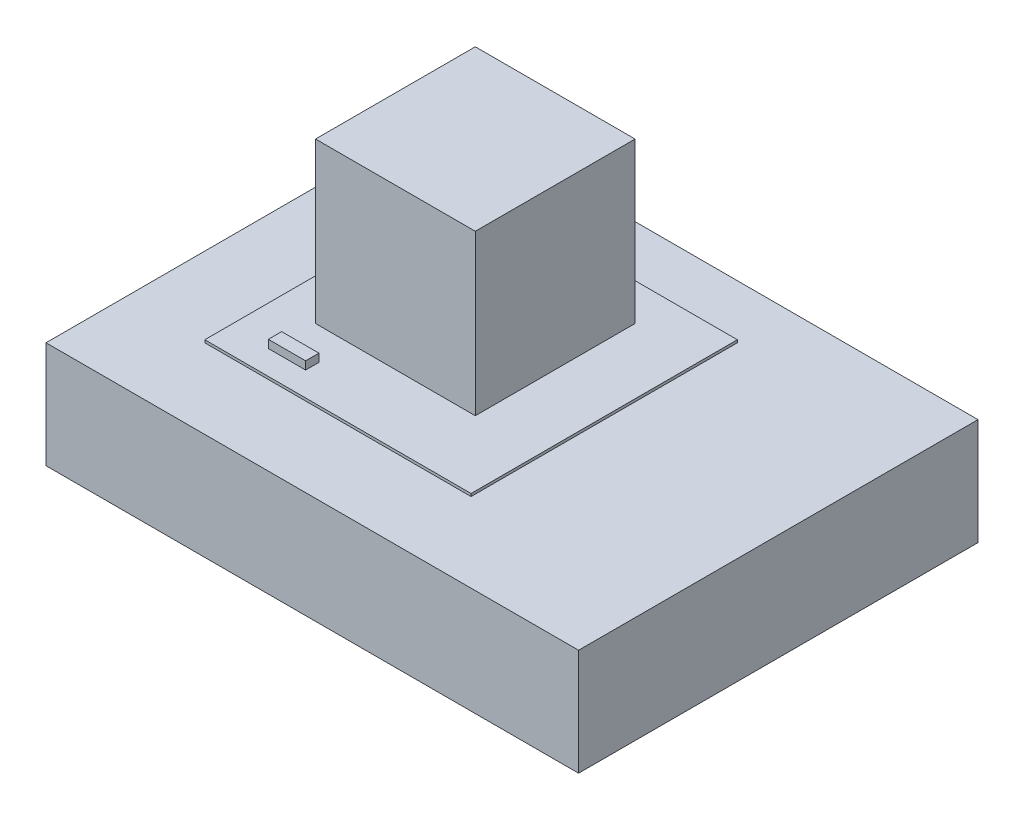
ISO-10303-21;
HEADER;
FILE_DESCRIPTION(('STEP AP214'),'2;1');
FILE_NAME('part.step','',(''),(''),'','','');
FILE_SCHEMA(('AUTOMOTIVE_DESIGN { 1 0 10303 214 1 1 1 1 }'));
ENDSEC;
DATA;
#1=APPLICATION_CONTEXT('core data for automotive mechanical design processes');
#2=APPLICATION_PROTOCOL_DEFINITION('international standard','automotive_design',2000,#1);
#3=PRODUCT_CONTEXT('',#1,'mechanical');
#4=PRODUCT('Part','Part','',(#3));
#5=PRODUCT_RELATED_PRODUCT_CATEGORY('part','',(#4));
#6=PRODUCT_DEFINITION_FORMATION('','',#4);
#7=PRODUCT_DEFINITION_CONTEXT('part definition',#1,'design');
#8=PRODUCT_DEFINITION('design','',#6,#7);
#9=PRODUCT_DEFINITION_SHAPE('','',#8);
#10=(LENGTH_UNIT() NAMED_UNIT(*) SI_UNIT(.MILLI.,.METRE.));
#11=(NAMED_UNIT(*) PLANE_ANGLE_UNIT() SI_UNIT($,.RADIAN.));
#12=(NAMED_UNIT(*) SI_UNIT($,.STERADIAN.) SOLID_ANGLE_UNIT());
#13=UNCERTAINTY_MEASURE_WITH_UNIT(LENGTH_MEASURE(1.E-05),#10,'distance_accuracy_value','');
#14=(GEOMETRIC_REPRESENTATION_CONTEXT(3) GLOBAL_UNCERTAINTY_ASSIGNED_CONTEXT((#13)) GLOBAL_UNIT_ASSIGNED_CONTEXT((#10,
#11,#12)) REPRESENTATION_CONTEXT('',''));
#15=CARTESIAN_POINT('',(0.,0.,0.));
#16=DIRECTION('',(0.,0.,1.));
#17=DIRECTION('',(1.,0.,0.));
#18=AXIS2_PLACEMENT_3D('',#15,#16,#17);
#19=CARTESIAN_POINT('',(0.,41.,0.));
#20=DIRECTION('',(0.,1.,0.));
#21=DIRECTION('',(0.,0.,1.));
#22=AXIS2_PLACEMENT_3D('',#19,#20,#21);
#23=PLANE('',#22);
#24=DIRECTION('',(1.,0.,0.));
#25=VECTOR('',#24,1.);
#26=CARTESIAN_POINT('',(-4.26515979318864,41.,60.));
#27=LINE('',#26,#25);
#28=CARTESIAN_POINT('',(-4.26515979318864,41.,60.));
#29=VERTEX_POINT('',#28);
#30=CARTESIAN_POINT('',(55.7348402068114,41.,60.));
#31=VERTEX_POINT('',#30);
#32=EDGE_CURVE('E179',#29,#31,#27,.T.);
#33=ORIENTED_EDGE('',*,*,#32,.F.);
#34=DIRECTION('',(0.,0.,1.));
#35=VECTOR('',#34,1.);
#36=CARTESIAN_POINT('',(-4.26515979318864,41.,0.));
#37=LINE('',#36,#35);
#38=CARTESIAN_POINT('',(-4.26515979318864,41.,0.));
#39=VERTEX_POINT('',#38);
#40=EDGE_CURVE('E176',#39,#29,#37,.T.);
#41=ORIENTED_EDGE('',*,*,#40,.F.);
#42=DIRECTION('',(-1.,0.,0.));
#43=VECTOR('',#42,1.);
#44=CARTESIAN_POINT('',(-4.26515979318864,41.,0.));
#45=LINE('',#44,#43);
#46=CARTESIAN_POINT('',(55.7348402068113,41.,0.));
#47=VERTEX_POINT('',#46);
#48=EDGE_CURVE('E188',#47,#39,#45,.T.);
#49=ORIENTED_EDGE('',*,*,#48,.F.);
#50=DIRECTION('',(0.,0.,-1.));
#51=VECTOR('',#50,1.);
#52=CARTESIAN_POINT('',(55.7348402068113,41.,0.));
#53=LINE('',#52,#51);
#54=EDGE_CURVE('E196',#31,#47,#53,.T.);
#55=ORIENTED_EDGE('',*,*,#54,.F.);
#56=EDGE_LOOP('',(#33,#41,#49,#55));
#57=FACE_BOUND('',#56,.T.);
#58=DIRECTION('',(0.,0.,1.));
#59=VECTOR('',#58,1.);
#60=CARTESIAN_POINT('',(-19.7768031434268,41.,-13.9236227884572));
#61=LINE('',#60,#59);
#62=CARTESIAN_POINT('',(-19.7768031434268,41.,-13.9236227884572));
#63=VERTEX_POINT('',#62);
#64=CARTESIAN_POINT('',(-19.7768031434268,41.,86.0763772115428));
#65=VERTEX_POINT('',#64);
#66=EDGE_CURVE('E208',#63,#65,#61,.T.);
#67=ORIENTED_EDGE('',*,*,#66,.T.);
#68=DIRECTION('',(1.,0.,0.));
#69=VECTOR('',#68,1.);
#70=CARTESIAN_POINT('',(-19.7768031434268,41.,86.0763772115428));
#71=LINE('',#70,#69);
#72=CARTESIAN_POINT('',(80.2231968565732,41.,86.0763772115428));
#73=VERTEX_POINT('',#72);
#74=EDGE_CURVE('E211',#65,#73,#71,.T.);
#75=ORIENTED_EDGE('',*,*,#74,.T.);
#76=DIRECTION('',(0.,0.,-1.));
#77=VECTOR('',#76,1.);
#78=CARTESIAN_POINT('',(80.2231968565732,41.,-13.9236227884572));
#79=LINE('',#78,#77);
#80=CARTESIAN_POINT('',(80.2231968565732,41.,-13.9236227884572));
#81=VERTEX_POINT('',#80);
#82=EDGE_CURVE('E214',#73,#81,#79,.T.);
#83=ORIENTED_EDGE('',*,*,#82,.T.);
#84=DIRECTION('',(-1.,0.,0.));
#85=VECTOR('',#84,1.);
#86=CARTESIAN_POINT('',(-19.7768031434268,41.,-13.9236227884572));
#87=LINE('',#86,#85);
#88=EDGE_CURVE('E216',#81,#63,#87,.T.);
#89=ORIENTED_EDGE('',*,*,#88,.T.);
#90=EDGE_LOOP('',(#67,#75,#83,#89));
#91=FACE_BOUND('',#90,.T.);
#92=DIRECTION('',(1.,0.,0.));
#93=VECTOR('',#92,1.);
#94=CARTESIAN_POINT('',(-4.98770208661092,41.,77.0000763242865));
#95=LINE('',#94,#93);
#96=CARTESIAN_POINT('',(-4.98770208661092,41.,77.0000763242865));
#97=VERTEX_POINT('',#96);
#98=CARTESIAN_POINT('',(9.01229791338908,41.,77.0000763242865));
#99=VERTEX_POINT('',#98);
#100=EDGE_CURVE('E496',#97,#99,#95,.T.);
#101=ORIENTED_EDGE('',*,*,#100,.F.);
#102=DIRECTION('',(0.,0.,1.));
#103=VECTOR('',#102,1.);
#104=CARTESIAN_POINT('',(-4.98770208661092,41.,72.0000763242865));
#105=LINE('',#104,#103);
#106=CARTESIAN_POINT('',(-4.98770208661092,41.,72.0000763242865));
#107=VERTEX_POINT('',#106);
#108=EDGE_CURVE('E174',#107,#97,#105,.T.);
#109=ORIENTED_EDGE('',*,*,#108,.F.);
#110=DIRECTION('',(-1.,0.,0.));
#111=VECTOR('',#110,1.);
#112=CARTESIAN_POINT('',(-4.98770208661092,41.,72.0000763242865));
#113=LINE('',#112,#111);
#114=CARTESIAN_POINT('',(9.01229791338908,41.,72.0000763242865));
#115=VERTEX_POINT('',#114);
#116=EDGE_CURVE('E170',#115,#107,#113,.T.);
#117=ORIENTED_EDGE('',*,*,#116,.F.);
#118=DIRECTION('',(0.,0.,-1.));
#119=VECTOR('',#118,1.);
#120=CARTESIAN_POINT('',(9.01229791338908,41.,72.0000763242865));
#121=LINE('',#120,#119);
#122=EDGE_CURVE('E493',#99,#115,#121,.T.);
#123=ORIENTED_EDGE('',*,*,#122,.F.);
#124=EDGE_LOOP('',(#101,#109,#117,#123));
#125=FACE_BOUND('',#124,.T.);
#126=ADVANCED_FACE('F37',(#57,#91,#125),#23,.T.);
#127=CARTESIAN_POINT('',(0.,40.,0.));
#128=DIRECTION('',(0.,1.,0.));
#129=DIRECTION('',(0.,0.,1.));
#130=AXIS2_PLACEMENT_3D('',#127,#128,#129);
#131=PLANE('',#130);
#132=DIRECTION('',(0.,0.,1.));
#133=VECTOR('',#132,1.);
#134=CARTESIAN_POINT('',(-49.6101921751245,40.,-34.1278167647669));
#135=LINE('',#134,#133);
#136=CARTESIAN_POINT('',(-49.6101921751245,40.,-34.1278167647669));
#137=VERTEX_POINT('',#136);
#138=CARTESIAN_POINT('',(-49.6101921751245,40.,115.872183235233));
#139=VERTEX_POINT('',#138);
#140=EDGE_CURVE('E237',#137,#139,#135,.T.);
#141=ORIENTED_EDGE('',*,*,#140,.T.);
#142=DIRECTION('',(1.,0.,0.));
#143=VECTOR('',#142,1.);
#144=CARTESIAN_POINT('',(-49.6101921751245,40.,115.872183235233));
#145=LINE('',#144,#143);
#146=CARTESIAN_POINT('',(150.389807824876,40.,115.872183235233));
#147=VERTEX_POINT('',#146);
#148=EDGE_CURVE('E240',#139,#147,#145,.T.);
#149=ORIENTED_EDGE('',*,*,#148,.T.);
#150=DIRECTION('',(0.,0.,-1.));
#151=VECTOR('',#150,1.);
#152=CARTESIAN_POINT('',(150.389807824875,40.,-34.1278167647669));
#153=LINE('',#152,#151);
#154=CARTESIAN_POINT('',(150.389807824875,40.,-34.1278167647669));
#155=VERTEX_POINT('',#154);
#156=EDGE_CURVE('E243',#147,#155,#153,.T.);
#157=ORIENTED_EDGE('',*,*,#156,.T.);
#158=DIRECTION('',(-1.,0.,0.));
#159=VECTOR('',#158,1.);
#160=CARTESIAN_POINT('',(-49.6101921751245,40.,-34.1278167647669));
#161=LINE('',#160,#159);
#162=EDGE_CURVE('E245',#155,#137,#161,.T.);
#163=ORIENTED_EDGE('',*,*,#162,.T.);
#164=EDGE_LOOP('',(#141,#149,#157,#163));
#165=FACE_BOUND('',#164,.T.);
#166=DIRECTION('',(1.,0.,0.));
#167=VECTOR('',#166,1.);
#168=CARTESIAN_POINT('',(-19.7768031434268,40.,86.0763772115428));
#169=LINE('',#168,#167);
#170=CARTESIAN_POINT('',(-19.7768031434268,40.,86.0763772115428));
#171=VERTEX_POINT('',#170);
#172=CARTESIAN_POINT('',(80.2231968565732,40.,86.0763772115428));
#173=VERTEX_POINT('',#172);
#174=EDGE_CURVE('E221',#171,#173,#169,.T.);
#175=ORIENTED_EDGE('',*,*,#174,.F.);
#176=DIRECTION('',(0.,0.,1.));
#177=VECTOR('',#176,1.);
#178=CARTESIAN_POINT('',(-19.7768031434268,40.,-13.9236227884572));
#179=LINE('',#178,#177);
#180=CARTESIAN_POINT('',(-19.7768031434268,40.,-13.9236227884572));
#181=VERTEX_POINT('',#180);
#182=EDGE_CURVE('E207',#181,#171,#179,.T.);
#183=ORIENTED_EDGE('',*,*,#182,.F.);
#184=DIRECTION('',(-1.,0.,0.));
#185=VECTOR('',#184,1.);
#186=CARTESIAN_POINT('',(-19.7768031434268,40.,-13.9236227884572));
#187=LINE('',#186,#185);
#188=CARTESIAN_POINT('',(80.2231968565732,40.,-13.9236227884572));
#189=VERTEX_POINT('',#188);
#190=EDGE_CURVE('E212',#189,#181,#187,.T.);
#191=ORIENTED_EDGE('',*,*,#190,.F.);
#192=DIRECTION('',(0.,0.,-1.));
#193=VECTOR('',#192,1.);
#194=CARTESIAN_POINT('',(80.2231968565732,40.,-13.9236227884572));
#195=LINE('',#194,#193);
#196=EDGE_CURVE('E223',#173,#189,#195,.T.);
#197=ORIENTED_EDGE('',*,*,#196,.F.);
#198=EDGE_LOOP('',(#175,#183,#191,#197));
#199=FACE_BOUND('',#198,.T.);
#200=ADVANCED_FACE('F279',(#165,#199),#131,.T.);
#201=CARTESIAN_POINT('',(-49.6101921751245,40.,-34.1278167647669));
#202=DIRECTION('',(1.,0.,0.));
#203=DIRECTION('',(0.,0.,-1.));
#204=AXIS2_PLACEMENT_3D('',#201,#202,#203);
#205=PLANE('',#204);
#206=DIRECTION('',(0.,0.,1.));
#207=VECTOR('',#206,1.);
#208=CARTESIAN_POINT('',(-49.6101921751245,0.,-34.1278167647669));
#209=LINE('',#208,#207);
#210=CARTESIAN_POINT('',(-49.6101921751245,0.,-34.1278167647669));
#211=VERTEX_POINT('',#210);
#212=CARTESIAN_POINT('',(-49.6101921751245,0.,115.872183235233));
#213=VERTEX_POINT('',#212);
#214=EDGE_CURVE('E236',#211,#213,#209,.T.);
#215=ORIENTED_EDGE('',*,*,#214,.T.);
#216=DIRECTION('',(0.,-1.,0.));
#217=VECTOR('',#216,1.);
#218=CARTESIAN_POINT('',(-49.6101921751245,40.,115.872183235233));
#219=LINE('',#218,#217);
#220=EDGE_CURVE('E11',#139,#213,#219,.T.);
#221=ORIENTED_EDGE('',*,*,#220,.F.);
#222=ORIENTED_EDGE('',*,*,#140,.F.);
#223=DIRECTION('',(0.,-1.,0.));
#224=VECTOR('',#223,1.);
#225=CARTESIAN_POINT('',(-49.6101921751245,40.,-34.1278167647669));
#226=LINE('',#225,#224);
#227=EDGE_CURVE('E247',#137,#211,#226,.T.);
#228=ORIENTED_EDGE('',*,*,#227,.T.);
#229=EDGE_LOOP('',(#215,#221,#222,#228));
#230=FACE_BOUND('',#229,.T.);
#231=ADVANCED_FACE('F39',(#230),#205,.F.);
#232=CARTESIAN_POINT('',(-49.6101921751245,40.,115.872183235233));
#233=DIRECTION('',(0.,0.,-1.));
#234=DIRECTION('',(-1.,0.,0.));
#235=AXIS2_PLACEMENT_3D('',#232,#233,#234);
#236=PLANE('',#235);
#237=DIRECTION('',(1.,0.,0.));
#238=VECTOR('',#237,1.);
#239=CARTESIAN_POINT('',(-49.6101921751245,0.,115.872183235233));
#240=LINE('',#239,#238);
#241=CARTESIAN_POINT('',(150.389807824876,0.,115.872183235233));
#242=VERTEX_POINT('',#241);
#243=EDGE_CURVE('E250',#213,#242,#240,.T.);
#244=ORIENTED_EDGE('',*,*,#243,.T.);
#245=DIRECTION('',(0.,-1.,0.));
#246=VECTOR('',#245,1.);
#247=CARTESIAN_POINT('',(150.389807824876,40.,115.872183235233));
#248=LINE('',#247,#246);
#249=EDGE_CURVE('E45',#147,#242,#248,.T.);
#250=ORIENTED_EDGE('',*,*,#249,.F.);
#251=ORIENTED_EDGE('',*,*,#148,.F.);
#252=ORIENTED_EDGE('',*,*,#220,.T.);
#253=EDGE_LOOP('',(#244,#250,#251,#252));
#254=FACE_BOUND('',#253,.T.);
#255=ADVANCED_FACE('F281',(#254),#236,.F.);
#256=CARTESIAN_POINT('',(150.389807824875,40.,-34.1278167647669));
#257=DIRECTION('',(-1.,0.,0.));
#258=DIRECTION('',(0.,0.,1.));
#259=AXIS2_PLACEMENT_3D('',#256,#257,#258);
#260=PLANE('',#259);
#261=DIRECTION('',(0.,0.,-1.));
#262=VECTOR('',#261,1.);
#263=CARTESIAN_POINT('',(150.389807824875,0.,-34.1278167647669));
#264=LINE('',#263,#262);
#265=CARTESIAN_POINT('',(150.389807824875,0.,-34.1278167647669));
#266=VERTEX_POINT('',#265);
#267=EDGE_CURVE('E252',#242,#266,#264,.T.);
#268=ORIENTED_EDGE('',*,*,#267,.T.);
#269=DIRECTION('',(0.,-1.,0.));
#270=VECTOR('',#269,1.);
#271=CARTESIAN_POINT('',(150.389807824875,40.,-34.1278167647669));
#272=LINE('',#271,#270);
#273=EDGE_CURVE('E257',#155,#266,#272,.T.);
#274=ORIENTED_EDGE('',*,*,#273,.F.);
#275=ORIENTED_EDGE('',*,*,#156,.F.);
#276=ORIENTED_EDGE('',*,*,#249,.T.);
#277=EDGE_LOOP('',(#268,#274,#275,#276));
#278=FACE_BOUND('',#277,.T.);
#279=ADVANCED_FACE('F264',(#278),#260,.F.);
#280=CARTESIAN_POINT('',(-49.6101921751245,40.,-34.1278167647669));
#281=DIRECTION('',(0.,0.,1.));
#282=DIRECTION('',(1.,0.,0.));
#283=AXIS2_PLACEMENT_3D('',#280,#281,#282);
#284=PLANE('',#283);
#285=DIRECTION('',(-1.,0.,0.));
#286=VECTOR('',#285,1.);
#287=CARTESIAN_POINT('',(-49.6101921751245,0.,-34.1278167647669));
#288=LINE('',#287,#286);
#289=EDGE_CURVE('E241',#266,#211,#288,.T.);
#290=ORIENTED_EDGE('',*,*,#289,.T.);
#291=ORIENTED_EDGE('',*,*,#227,.F.);
#292=ORIENTED_EDGE('',*,*,#162,.F.);
#293=ORIENTED_EDGE('',*,*,#273,.T.);
#294=EDGE_LOOP('',(#290,#291,#292,#293));
#295=FACE_BOUND('',#294,.T.);
#296=ADVANCED_FACE('F273',(#295),#284,.F.);
#297=CARTESIAN_POINT('',(0.,0.,0.));
#298=DIRECTION('',(0.,1.,0.));
#299=DIRECTION('',(0.,0.,1.));
#300=AXIS2_PLACEMENT_3D('',#297,#298,#299);
#301=PLANE('',#300);
#302=ORIENTED_EDGE('',*,*,#214,.F.);
#303=ORIENTED_EDGE('',*,*,#289,.F.);
#304=ORIENTED_EDGE('',*,*,#267,.F.);
#305=ORIENTED_EDGE('',*,*,#243,.F.);
#306=EDGE_LOOP('',(#302,#303,#304,#305));
#307=FACE_BOUND('',#306,.T.);
#308=ADVANCED_FACE('F270',(#307),#301,.F.);
#309=CARTESIAN_POINT('',(-19.7768031434268,41.,-13.9236227884572));
#310=DIRECTION('',(1.,0.,0.));
#311=DIRECTION('',(0.,0.,-1.));
#312=AXIS2_PLACEMENT_3D('',#309,#310,#311);
#313=PLANE('',#312);
#314=ORIENTED_EDGE('',*,*,#182,.T.);
#315=DIRECTION('',(0.,-1.,0.));
#316=VECTOR('',#315,1.);
#317=CARTESIAN_POINT('',(-19.7768031434268,41.,86.0763772115428));
#318=LINE('',#317,#316);
#319=EDGE_CURVE('E234',#65,#171,#318,.T.);
#320=ORIENTED_EDGE('',*,*,#319,.F.);
#321=ORIENTED_EDGE('',*,*,#66,.F.);
#322=DIRECTION('',(0.,-1.,0.));
#323=VECTOR('',#322,1.);
#324=CARTESIAN_POINT('',(-19.7768031434268,41.,-13.9236227884572));
#325=LINE('',#324,#323);
#326=EDGE_CURVE('E218',#63,#181,#325,.T.);
#327=ORIENTED_EDGE('',*,*,#326,.T.);
#328=EDGE_LOOP('',(#314,#320,#321,#327));
#329=FACE_BOUND('',#328,.T.);
#330=ADVANCED_FACE('F312',(#329),#313,.F.);
#331=CARTESIAN_POINT('',(-19.7768031434268,41.,86.0763772115428));
#332=DIRECTION('',(0.,0.,-1.));
#333=DIRECTION('',(-1.,0.,0.));
#334=AXIS2_PLACEMENT_3D('',#331,#332,#333);
#335=PLANE('',#334);
#336=ORIENTED_EDGE('',*,*,#174,.T.);
#337=DIRECTION('',(0.,-1.,0.));
#338=VECTOR('',#337,1.);
#339=CARTESIAN_POINT('',(80.2231968565732,41.,86.0763772115428));
#340=LINE('',#339,#338);
#341=EDGE_CURVE('E231',#73,#173,#340,.T.);
#342=ORIENTED_EDGE('',*,*,#341,.F.);
#343=ORIENTED_EDGE('',*,*,#74,.F.);
#344=ORIENTED_EDGE('',*,*,#319,.T.);
#345=EDGE_LOOP('',(#336,#342,#343,#344));
#346=FACE_BOUND('',#345,.T.);
#347=ADVANCED_FACE('F308',(#346),#335,.F.);
#348=CARTESIAN_POINT('',(80.2231968565732,41.,-13.9236227884572));
#349=DIRECTION('',(-1.,0.,0.));
#350=DIRECTION('',(0.,0.,1.));
#351=AXIS2_PLACEMENT_3D('',#348,#349,#350);
#352=PLANE('',#351);
#353=ORIENTED_EDGE('',*,*,#196,.T.);
#354=DIRECTION('',(0.,-1.,0.));
#355=VECTOR('',#354,1.);
#356=CARTESIAN_POINT('',(80.2231968565732,41.,-13.9236227884572));
#357=LINE('',#356,#355);
#358=EDGE_CURVE('E229',#81,#189,#357,.T.);
#359=ORIENTED_EDGE('',*,*,#358,.F.);
#360=ORIENTED_EDGE('',*,*,#82,.F.);
#361=ORIENTED_EDGE('',*,*,#341,.T.);
#362=EDGE_LOOP('',(#353,#359,#360,#361));
#363=FACE_BOUND('',#362,.T.);
#364=ADVANCED_FACE('F304',(#363),#352,.F.);
#365=CARTESIAN_POINT('',(-19.7768031434268,41.,-13.9236227884572));
#366=DIRECTION('',(0.,0.,1.));
#367=DIRECTION('',(1.,0.,0.));
#368=AXIS2_PLACEMENT_3D('',#365,#366,#367);
#369=PLANE('',#368);
#370=ORIENTED_EDGE('',*,*,#190,.T.);
#371=ORIENTED_EDGE('',*,*,#326,.F.);
#372=ORIENTED_EDGE('',*,*,#88,.F.);
#373=ORIENTED_EDGE('',*,*,#358,.T.);
#374=EDGE_LOOP('',(#370,#371,#372,#373));
#375=FACE_BOUND('',#374,.T.);
#376=ADVANCED_FACE('F301',(#375),#369,.F.);
#377=CARTESIAN_POINT('',(-4.26515979318864,101.,0.));
#378=DIRECTION('',(1.,0.,0.));
#379=DIRECTION('',(0.,0.,-1.));
#380=AXIS2_PLACEMENT_3D('',#377,#378,#379);
#381=PLANE('',#380);
#382=ORIENTED_EDGE('',*,*,#40,.T.);
#383=DIRECTION('',(0.,-1.,0.));
#384=VECTOR('',#383,1.);
#385=CARTESIAN_POINT('',(-4.26515979318864,101.,60.));
#386=LINE('',#385,#384);
#387=CARTESIAN_POINT('',(-4.26515979318864,101.,60.));
#388=VERTEX_POINT('',#387);
#389=EDGE_CURVE('E205',#388,#29,#386,.T.);
#390=ORIENTED_EDGE('',*,*,#389,.F.);
#391=DIRECTION('',(0.,0.,1.));
#392=VECTOR('',#391,1.);
#393=CARTESIAN_POINT('',(-4.26515979318864,101.,0.));
#394=LINE('',#393,#392);
#395=CARTESIAN_POINT('',(-4.26515979318864,101.,0.));
#396=VERTEX_POINT('',#395);
#397=EDGE_CURVE('E184',#396,#388,#394,.T.);
#398=ORIENTED_EDGE('',*,*,#397,.F.);
#399=DIRECTION('',(0.,-1.,0.));
#400=VECTOR('',#399,1.);
#401=CARTESIAN_POINT('',(-4.26515979318864,101.,0.));
#402=LINE('',#401,#400);
#403=EDGE_CURVE('E193',#396,#39,#402,.T.);
#404=ORIENTED_EDGE('',*,*,#403,.T.);
#405=EDGE_LOOP('',(#382,#390,#398,#404));
#406=FACE_BOUND('',#405,.T.);
#407=ADVANCED_FACE('F299',(#406),#381,.F.);
#408=CARTESIAN_POINT('',(-4.26515979318864,101.,60.));
#409=DIRECTION('',(0.,0.,-1.));
#410=DIRECTION('',(-1.,0.,0.));
#411=AXIS2_PLACEMENT_3D('',#408,#409,#410);
#412=PLANE('',#411);
#413=ORIENTED_EDGE('',*,*,#32,.T.);
#414=DIRECTION('',(0.,-1.,0.));
#415=VECTOR('',#414,1.);
#416=CARTESIAN_POINT('',(55.7348402068114,101.,60.));
#417=LINE('',#416,#415);
#418=CARTESIAN_POINT('',(55.7348402068114,101.,60.));
#419=VERTEX_POINT('',#418);
#420=EDGE_CURVE('E202',#419,#31,#417,.T.);
#421=ORIENTED_EDGE('',*,*,#420,.F.);
#422=DIRECTION('',(1.,0.,0.));
#423=VECTOR('',#422,1.);
#424=CARTESIAN_POINT('',(-4.26515979318864,101.,60.));
#425=LINE('',#424,#423);
#426=EDGE_CURVE('E187',#388,#419,#425,.T.);
#427=ORIENTED_EDGE('',*,*,#426,.F.);
#428=ORIENTED_EDGE('',*,*,#389,.T.);
#429=EDGE_LOOP('',(#413,#421,#427,#428));
#430=FACE_BOUND('',#429,.T.);
#431=ADVANCED_FACE('F351',(#430),#412,.F.);
#432=CARTESIAN_POINT('',(55.7348402068113,101.,0.));
#433=DIRECTION('',(-1.,0.,0.));
#434=DIRECTION('',(0.,0.,1.));
#435=AXIS2_PLACEMENT_3D('',#432,#433,#434);
#436=PLANE('',#435);
#437=ORIENTED_EDGE('',*,*,#54,.T.);
#438=DIRECTION('',(0.,-1.,0.));
#439=VECTOR('',#438,1.);
#440=CARTESIAN_POINT('',(55.7348402068113,101.,0.));
#441=LINE('',#440,#439);
#442=CARTESIAN_POINT('',(55.7348402068113,101.,0.));
#443=VERTEX_POINT('',#442);
#444=EDGE_CURVE('E60',#443,#47,#441,.T.);
#445=ORIENTED_EDGE('',*,*,#444,.F.);
#446=DIRECTION('',(0.,0.,-1.));
#447=VECTOR('',#446,1.);
#448=CARTESIAN_POINT('',(55.7348402068113,101.,0.));
#449=LINE('',#448,#447);
#450=EDGE_CURVE('E190',#419,#443,#449,.T.);
#451=ORIENTED_EDGE('',*,*,#450,.F.);
#452=ORIENTED_EDGE('',*,*,#420,.T.);
#453=EDGE_LOOP('',(#437,#445,#451,#452));
#454=FACE_BOUND('',#453,.T.);
#455=ADVANCED_FACE('F358',(#454),#436,.F.);
#456=CARTESIAN_POINT('',(-4.26515979318864,101.,0.));
#457=DIRECTION('',(0.,0.,1.));
#458=DIRECTION('',(1.,0.,0.));
#459=AXIS2_PLACEMENT_3D('',#456,#457,#458);
#460=PLANE('',#459);
#461=ORIENTED_EDGE('',*,*,#48,.T.);
#462=ORIENTED_EDGE('',*,*,#403,.F.);
#463=DIRECTION('',(-1.,0.,0.));
#464=VECTOR('',#463,1.);
#465=CARTESIAN_POINT('',(-4.26515979318864,101.,0.));
#466=LINE('',#465,#464);
#467=EDGE_CURVE('E192',#443,#396,#466,.T.);
#468=ORIENTED_EDGE('',*,*,#467,.F.);
#469=ORIENTED_EDGE('',*,*,#444,.T.);
#470=EDGE_LOOP('',(#461,#462,#468,#469));
#471=FACE_BOUND('',#470,.T.);
#472=ADVANCED_FACE('F365',(#471),#460,.F.);
#473=CARTESIAN_POINT('',(0.,101.,0.));
#474=DIRECTION('',(0.,1.,0.));
#475=DIRECTION('',(0.,0.,1.));
#476=AXIS2_PLACEMENT_3D('',#473,#474,#475);
#477=PLANE('',#476);
#478=ORIENTED_EDGE('',*,*,#397,.T.);
#479=ORIENTED_EDGE('',*,*,#426,.T.);
#480=ORIENTED_EDGE('',*,*,#450,.T.);
#481=ORIENTED_EDGE('',*,*,#467,.T.);
#482=EDGE_LOOP('',(#478,#479,#480,#481));
#483=FACE_BOUND('',#482,.T.);
#484=ADVANCED_FACE('F373',(#483),#477,.T.);
#485=CARTESIAN_POINT('',(-4.98770208661092,44.,72.0000763242865));
#486=DIRECTION('',(1.,0.,0.));
#487=DIRECTION('',(0.,0.,-1.));
#488=AXIS2_PLACEMENT_3D('',#485,#486,#487);
#489=PLANE('',#488);
#490=ORIENTED_EDGE('',*,*,#108,.T.);
#491=DIRECTION('',(0.,-1.,0.));
#492=VECTOR('',#491,1.);
#493=CARTESIAN_POINT('',(-4.98770208661092,44.,77.0000763242865));
#494=LINE('',#493,#492);
#495=CARTESIAN_POINT('',(-4.98770208661092,44.,77.0000763242865));
#496=VERTEX_POINT('',#495);
#497=EDGE_CURVE('E155',#496,#97,#494,.T.);
#498=ORIENTED_EDGE('',*,*,#497,.F.);
#499=DIRECTION('',(0.,0.,1.));
#500=VECTOR('',#499,1.);
#501=CARTESIAN_POINT('',(-4.98770208661092,44.,72.0000763242865));
#502=LINE('',#501,#500);
#503=CARTESIAN_POINT('',(-4.98770208661092,44.,72.0000763242865));
#504=VERTEX_POINT('',#503);
#505=EDGE_CURVE('E162',#504,#496,#502,.T.);
#506=ORIENTED_EDGE('',*,*,#505,.F.);
#507=DIRECTION('',(0.,-1.,0.));
#508=VECTOR('',#507,1.);
#509=CARTESIAN_POINT('',(-4.98770208661092,44.,72.0000763242865));
#510=LINE('',#509,#508);
#511=EDGE_CURVE('E490',#504,#107,#510,.T.);
#512=ORIENTED_EDGE('',*,*,#511,.T.);
#513=EDGE_LOOP('',(#490,#498,#506,#512));
#514=FACE_BOUND('',#513,.T.);
#515=ADVANCED_FACE('F172',(#514),#489,.F.);
#516=CARTESIAN_POINT('',(-4.98770208661092,44.,77.0000763242865));
#517=DIRECTION('',(0.,0.,-1.));
#518=DIRECTION('',(-1.,0.,0.));
#519=AXIS2_PLACEMENT_3D('',#516,#517,#518);
#520=PLANE('',#519);
#521=ORIENTED_EDGE('',*,*,#100,.T.);
#522=DIRECTION('',(0.,-1.,0.));
#523=VECTOR('',#522,1.);
#524=CARTESIAN_POINT('',(9.01229791338908,44.,77.0000763242865));
#525=LINE('',#524,#523);
#526=CARTESIAN_POINT('',(9.01229791338908,44.,77.0000763242865));
#527=VERTEX_POINT('',#526);
#528=EDGE_CURVE('E158',#527,#99,#525,.T.);
#529=ORIENTED_EDGE('',*,*,#528,.F.);
#530=DIRECTION('',(1.,0.,0.));
#531=VECTOR('',#530,1.);
#532=CARTESIAN_POINT('',(-4.98770208661092,44.,77.0000763242865));
#533=LINE('',#532,#531);
#534=EDGE_CURVE('E151',#496,#527,#533,.T.);
#535=ORIENTED_EDGE('',*,*,#534,.F.);
#536=ORIENTED_EDGE('',*,*,#497,.T.);
#537=EDGE_LOOP('',(#521,#529,#535,#536));
#538=FACE_BOUND('',#537,.T.);
#539=ADVANCED_FACE('F153',(#538),#520,.F.);
#540=CARTESIAN_POINT('',(9.01229791338908,44.,72.0000763242865));
#541=DIRECTION('',(-1.,0.,0.));
#542=DIRECTION('',(0.,0.,1.));
#543=AXIS2_PLACEMENT_3D('',#540,#541,#542);
#544=PLANE('',#543);
#545=ORIENTED_EDGE('',*,*,#122,.T.);
#546=DIRECTION('',(0.,-1.,0.));
#547=VECTOR('',#546,1.);
#548=CARTESIAN_POINT('',(9.01229791338908,44.,72.0000763242865));
#549=LINE('',#548,#547);
#550=CARTESIAN_POINT('',(9.01229791338908,44.,72.0000763242865));
#551=VERTEX_POINT('',#550);
#552=EDGE_CURVE('E52',#551,#115,#549,.T.);
#553=ORIENTED_EDGE('',*,*,#552,.F.);
#554=DIRECTION('',(0.,0.,-1.));
#555=VECTOR('',#554,1.);
#556=CARTESIAN_POINT('',(9.01229791338908,44.,72.0000763242865));
#557=LINE('',#556,#555);
#558=EDGE_CURVE('E161',#527,#551,#557,.T.);
#559=ORIENTED_EDGE('',*,*,#558,.F.);
#560=ORIENTED_EDGE('',*,*,#528,.T.);
#561=EDGE_LOOP('',(#545,#553,#559,#560));
#562=FACE_BOUND('',#561,.T.);
#563=ADVANCED_FACE('F394',(#562),#544,.F.);
#564=CARTESIAN_POINT('',(-4.98770208661092,44.,72.0000763242865));
#565=DIRECTION('',(0.,0.,1.));
#566=DIRECTION('',(1.,0.,0.));
#567=AXIS2_PLACEMENT_3D('',#564,#565,#566);
#568=PLANE('',#567);
#569=ORIENTED_EDGE('',*,*,#116,.T.);
#570=ORIENTED_EDGE('',*,*,#511,.F.);
#571=DIRECTION('',(-1.,0.,0.));
#572=VECTOR('',#571,1.);
#573=CARTESIAN_POINT('',(-4.98770208661092,44.,72.0000763242865));
#574=LINE('',#573,#572);
#575=EDGE_CURVE('E166',#551,#504,#574,.T.);
#576=ORIENTED_EDGE('',*,*,#575,.F.);
#577=ORIENTED_EDGE('',*,*,#552,.T.);
#578=EDGE_LOOP('',(#569,#570,#576,#577));
#579=FACE_BOUND('',#578,.T.);
#580=ADVANCED_FACE('F402',(#579),#568,.F.);
#581=CARTESIAN_POINT('',(0.,44.,0.));
#582=DIRECTION('',(0.,1.,0.));
#583=DIRECTION('',(0.,0.,1.));
#584=AXIS2_PLACEMENT_3D('',#581,#582,#583);
#585=PLANE('',#584);
#586=ORIENTED_EDGE('',*,*,#505,.T.);
#587=ORIENTED_EDGE('',*,*,#534,.T.);
#588=ORIENTED_EDGE('',*,*,#558,.T.);
#589=ORIENTED_EDGE('',*,*,#575,.T.);
#590=EDGE_LOOP('',(#586,#587,#588,#589));
#591=FACE_BOUND('',#590,.T.);
#592=ADVANCED_FACE('F165',(#591),#585,.T.);
#593=CLOSED_SHELL('',(#126,#200,#231,#255,#279,#296,#308,#330,#347,#364,#376,#407,#431,#455,
#472,#484,#515,#539,#563,#580,#592));
#594=MANIFOLD_SOLID_BREP('B2',#593);
#595=ADVANCED_BREP_SHAPE_REPRESENTATION('',(#18,#594),#14);
#596=SHAPE_DEFINITION_REPRESENTATION(#9,#595);
ENDSEC;
END-ISO-10303-21;
